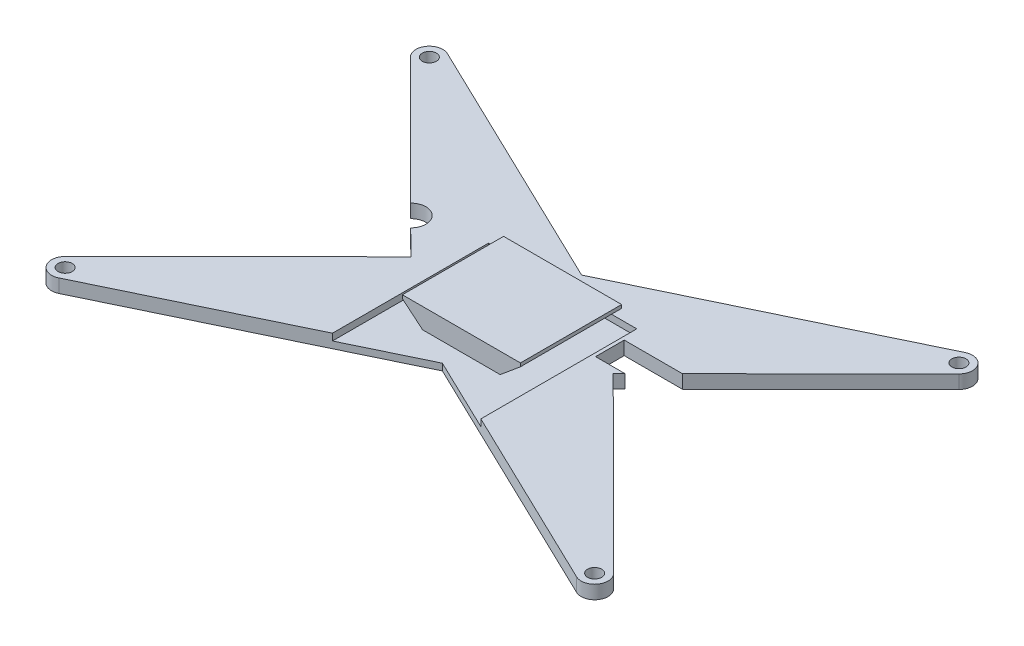
ISO-10303-21;
HEADER;
FILE_DESCRIPTION(('STEP AP214'),'2;1');
FILE_NAME('part.step','',(''),(''),'','','');
FILE_SCHEMA(('AUTOMOTIVE_DESIGN { 1 0 10303 214 1 1 1 1 }'));
ENDSEC;
DATA;
#1=APPLICATION_CONTEXT('core data for automotive mechanical design processes');
#2=APPLICATION_PROTOCOL_DEFINITION('international standard','automotive_design',2000,#1);
#3=PRODUCT_CONTEXT('',#1,'mechanical');
#4=PRODUCT('Part','Part','',(#3));
#5=PRODUCT_RELATED_PRODUCT_CATEGORY('part','',(#4));
#6=PRODUCT_DEFINITION_FORMATION('','',#4);
#7=PRODUCT_DEFINITION_CONTEXT('part definition',#1,'design');
#8=PRODUCT_DEFINITION('design','',#6,#7);
#9=PRODUCT_DEFINITION_SHAPE('','',#8);
#10=(LENGTH_UNIT() NAMED_UNIT(*) SI_UNIT(.MILLI.,.METRE.));
#11=(NAMED_UNIT(*) PLANE_ANGLE_UNIT() SI_UNIT($,.RADIAN.));
#12=(NAMED_UNIT(*) SI_UNIT($,.STERADIAN.) SOLID_ANGLE_UNIT());
#13=UNCERTAINTY_MEASURE_WITH_UNIT(LENGTH_MEASURE(1.E-05),#10,'distance_accuracy_value','');
#14=(GEOMETRIC_REPRESENTATION_CONTEXT(3) GLOBAL_UNCERTAINTY_ASSIGNED_CONTEXT((#13)) GLOBAL_UNIT_ASSIGNED_CONTEXT((#10,
#11,#12)) REPRESENTATION_CONTEXT('',''));
#15=CARTESIAN_POINT('',(0.,0.,0.));
#16=DIRECTION('',(0.,0.,1.));
#17=DIRECTION('',(1.,0.,0.));
#18=AXIS2_PLACEMENT_3D('',#15,#16,#17);
#19=CARTESIAN_POINT('',(14.9540896079356,-2.,14.9999297410321));
#20=DIRECTION('',(0.706023833590518,0.,0.708188072761854));
#21=DIRECTION('',(0.708188072761854,0.,-0.706023833590518));
#22=AXIS2_PLACEMENT_3D('',#19,#20,#21);
#23=PLANE('',#22);
#24=DIRECTION('',(0.,-1.,0.));
#25=VECTOR('',#24,1.);
#26=CARTESIAN_POINT('',(31.7565707063281,-2.,-1.75120258551938));
#27=LINE('',#26,#25);
#28=CARTESIAN_POINT('',(31.7565707063281,2.,-1.75120258551938));
#29=VERTEX_POINT('',#28);
#30=CARTESIAN_POINT('',(31.7565707063281,-2.,-1.75120258551938));
#31=VERTEX_POINT('',#30);
#32=EDGE_CURVE('E318',#29,#31,#27,.T.);
#33=ORIENTED_EDGE('',*,*,#32,.F.);
#34=DIRECTION('',(0.708188072761854,0.,-0.706023833590518));
#35=VECTOR('',#34,1.);
#36=CARTESIAN_POINT('',(14.9540896079356,2.,14.9999297410321));
#37=LINE('',#36,#35);
#38=CARTESIAN_POINT('',(30.,2.,0.));
#39=VERTEX_POINT('',#38);
#40=EDGE_CURVE('E339',#39,#29,#37,.T.);
#41=ORIENTED_EDGE('',*,*,#40,.F.);
#42=DIRECTION('',(0.,1.,0.));
#43=VECTOR('',#42,1.);
#44=CARTESIAN_POINT('',(30.,-2.,0.));
#45=LINE('',#44,#43);
#46=CARTESIAN_POINT('',(30.,-2.,0.));
#47=VERTEX_POINT('',#46);
#48=EDGE_CURVE('E497',#47,#39,#45,.T.);
#49=ORIENTED_EDGE('',*,*,#48,.F.);
#50=DIRECTION('',(0.708188072761854,0.,-0.706023833590518));
#51=VECTOR('',#50,1.);
#52=CARTESIAN_POINT('',(14.9540896079356,-2.,14.9999297410321));
#53=LINE('',#52,#51);
#54=EDGE_CURVE('E477',#47,#31,#53,.T.);
#55=ORIENTED_EDGE('',*,*,#54,.T.);
#56=EDGE_LOOP('',(#33,#41,#49,#55));
#57=FACE_BOUND('',#56,.T.);
#58=ADVANCED_FACE('F97',(#57),#23,.T.);
#59=CARTESIAN_POINT('',(-14.9540896079355,-2.,14.9999297410321));
#60=DIRECTION('',(0.706023833590518,0.,-0.708188072761854));
#61=DIRECTION('',(-0.708188072761854,0.,-0.706023833590518));
#62=AXIS2_PLACEMENT_3D('',#59,#60,#61);
#63=PLANE('',#62);
#64=DIRECTION('',(0.708188072761854,0.,0.706023833590518));
#65=VECTOR('',#64,1.);
#66=CARTESIAN_POINT('',(-14.9540896079355,2.,14.9999297410321));
#67=LINE('',#66,#65);
#68=CARTESIAN_POINT('',(-37.4359747639995,2.,-7.41325025270046));
#69=VERTEX_POINT('',#68);
#70=CARTESIAN_POINT('',(-30.,2.,0.));
#71=VERTEX_POINT('',#70);
#72=EDGE_CURVE('E354',#69,#71,#67,.T.);
#73=ORIENTED_EDGE('',*,*,#72,.F.);
#74=DIRECTION('',(0.,-1.,0.));
#75=VECTOR('',#74,1.);
#76=CARTESIAN_POINT('',(-37.4359747639995,31.,-7.41325025270046));
#77=LINE('',#76,#75);
#78=CARTESIAN_POINT('',(-37.4359747639995,-2.,-7.41325025270046));
#79=VERTEX_POINT('',#78);
#80=EDGE_CURVE('E113',#69,#79,#77,.T.);
#81=ORIENTED_EDGE('',*,*,#80,.T.);
#82=DIRECTION('',(-0.708188072761854,0.,-0.706023833590518));
#83=VECTOR('',#82,1.);
#84=CARTESIAN_POINT('',(-14.9540896079355,-2.,14.9999297410321));
#85=LINE('',#84,#83);
#86=CARTESIAN_POINT('',(-30.,-2.,0.));
#87=VERTEX_POINT('',#86);
#88=EDGE_CURVE('E459',#87,#79,#85,.T.);
#89=ORIENTED_EDGE('',*,*,#88,.F.);
#90=DIRECTION('',(0.,1.,0.));
#91=VECTOR('',#90,1.);
#92=CARTESIAN_POINT('',(-30.,-2.,0.));
#93=LINE('',#92,#91);
#94=EDGE_CURVE('E509',#87,#71,#93,.T.);
#95=ORIENTED_EDGE('',*,*,#94,.T.);
#96=EDGE_LOOP('',(#73,#81,#89,#95));
#97=FACE_BOUND('',#96,.T.);
#98=ADVANCED_FACE('F590',(#97),#63,.F.);
#99=CARTESIAN_POINT('',(0.,0.,0.));
#100=DIRECTION('',(0.,1.,0.));
#101=DIRECTION('',(0.,0.,1.));
#102=AXIS2_PLACEMENT_3D('',#99,#100,#101);
#103=PLANE('',#102);
#104=DIRECTION('',(0.,0.,-1.));
#105=VECTOR('',#104,1.);
#106=CARTESIAN_POINT('',(22.,0.,0.));
#107=LINE('',#106,#105);
#108=CARTESIAN_POINT('',(22.,0.,31.2313306001584));
#109=VERTEX_POINT('',#108);
#110=CARTESIAN_POINT('',(22.,0.,-15.));
#111=VERTEX_POINT('',#110);
#112=EDGE_CURVE('E382',#109,#111,#107,.T.);
#113=ORIENTED_EDGE('',*,*,#112,.T.);
#114=DIRECTION('',(1.,0.,0.));
#115=VECTOR('',#114,1.);
#116=CARTESIAN_POINT('',(-22.,0.,-15.));
#117=LINE('',#116,#115);
#118=CARTESIAN_POINT('',(11.5,0.,-15.));
#119=VERTEX_POINT('',#118);
#120=EDGE_CURVE('E324',#119,#111,#117,.T.);
#121=ORIENTED_EDGE('',*,*,#120,.F.);
#122=DIRECTION('',(0.,0.,-1.));
#123=VECTOR('',#122,1.);
#124=CARTESIAN_POINT('',(11.5,0.,-15.));
#125=LINE('',#124,#123);
#126=CARTESIAN_POINT('',(11.5,0.,15.));
#127=VERTEX_POINT('',#126);
#128=EDGE_CURVE('E443',#127,#119,#125,.T.);
#129=ORIENTED_EDGE('',*,*,#128,.F.);
#130=DIRECTION('',(1.,0.,0.));
#131=VECTOR('',#130,1.);
#132=CARTESIAN_POINT('',(-11.5,0.,15.));
#133=LINE('',#132,#131);
#134=CARTESIAN_POINT('',(-11.5,0.,15.));
#135=VERTEX_POINT('',#134);
#136=EDGE_CURVE('E448',#135,#127,#133,.T.);
#137=ORIENTED_EDGE('',*,*,#136,.F.);
#138=DIRECTION('',(0.,0.,1.));
#139=VECTOR('',#138,1.);
#140=CARTESIAN_POINT('',(-11.5,0.,-15.));
#141=LINE('',#140,#139);
#142=CARTESIAN_POINT('',(-11.5,0.,-15.));
#143=VERTEX_POINT('',#142);
#144=EDGE_CURVE('E446',#143,#135,#141,.T.);
#145=ORIENTED_EDGE('',*,*,#144,.F.);
#146=CARTESIAN_POINT('',(-22.,0.,-15.));
#147=VERTEX_POINT('',#146);
#148=EDGE_CURVE('E401',#147,#143,#117,.T.);
#149=ORIENTED_EDGE('',*,*,#148,.F.);
#150=DIRECTION('',(0.,0.,1.));
#151=VECTOR('',#150,1.);
#152=CARTESIAN_POINT('',(-22.,0.,0.));
#153=LINE('',#152,#151);
#154=CARTESIAN_POINT('',(-22.,0.,31.2313306001584));
#155=VERTEX_POINT('',#154);
#156=EDGE_CURVE('E329',#147,#155,#153,.T.);
#157=ORIENTED_EDGE('',*,*,#156,.T.);
#158=DIRECTION('',(-0.90097292924137,0.,0.433875305559357));
#159=VECTOR('',#158,1.);
#160=CARTESIAN_POINT('',(8.06718530012738,0.,16.7520840145956));
#161=LINE('',#160,#159);
#162=CARTESIAN_POINT('',(0.,0.,20.6369426751592));
#163=VERTEX_POINT('',#162);
#164=EDGE_CURVE('E451',#163,#155,#161,.T.);
#165=ORIENTED_EDGE('',*,*,#164,.F.);
#166=DIRECTION('',(0.90097292924137,0.,0.433875305559357));
#167=VECTOR('',#166,1.);
#168=CARTESIAN_POINT('',(-8.06718530012738,0.,16.7520840145956));
#169=LINE('',#168,#167);
#170=EDGE_CURVE('E456',#163,#109,#169,.T.);
#171=ORIENTED_EDGE('',*,*,#170,.T.);
#172=EDGE_LOOP('',(#113,#121,#129,#137,#145,#149,#157,#165,#171));
#173=FACE_BOUND('',#172,.T.);
#174=ADVANCED_FACE('F597',(#173),#103,.T.);
#175=CARTESIAN_POINT('',(8.06718530012738,-2.,-16.7520840145956));
#176=DIRECTION('',(0.433875305559357,0.,-0.90097292924137));
#177=DIRECTION('',(-0.90097292924137,0.,-0.433875305559357));
#178=AXIS2_PLACEMENT_3D('',#175,#176,#177);
#179=PLANE('',#178);
#180=DIRECTION('',(0.,1.,0.));
#181=VECTOR('',#180,1.);
#182=CARTESIAN_POINT('',(-76.7644987777626,-2.,-57.6038917169655));
#183=LINE('',#182,#181);
#184=CARTESIAN_POINT('',(-76.7644987777626,-2.,-57.6038917169655));
#185=VERTEX_POINT('',#184);
#186=CARTESIAN_POINT('',(-76.7644987777626,2.,-57.6038917169655));
#187=VERTEX_POINT('',#186);
#188=EDGE_CURVE('E485',#185,#187,#183,.T.);
#189=ORIENTED_EDGE('',*,*,#188,.T.);
#190=DIRECTION('',(-0.90097292924137,0.,-0.433875305559357));
#191=VECTOR('',#190,1.);
#192=CARTESIAN_POINT('',(8.06718530012739,2.,-16.7520840145956));
#193=LINE('',#192,#191);
#194=CARTESIAN_POINT('',(0.,2.,-20.6369426751592));
#195=VERTEX_POINT('',#194);
#196=EDGE_CURVE('E348',#195,#187,#193,.T.);
#197=ORIENTED_EDGE('',*,*,#196,.F.);
#198=DIRECTION('',(0.,1.,0.));
#199=VECTOR('',#198,1.);
#200=CARTESIAN_POINT('',(0.,-2.,-20.6369426751592));
#201=LINE('',#200,#199);
#202=CARTESIAN_POINT('',(0.,-2.,-20.6369426751592));
#203=VERTEX_POINT('',#202);
#204=EDGE_CURVE('E490',#203,#195,#201,.T.);
#205=ORIENTED_EDGE('',*,*,#204,.F.);
#206=DIRECTION('',(-0.90097292924137,0.,-0.433875305559357));
#207=VECTOR('',#206,1.);
#208=CARTESIAN_POINT('',(8.06718530012738,-2.,-16.7520840145956));
#209=LINE('',#208,#207);
#210=EDGE_CURVE('E452',#203,#185,#209,.T.);
#211=ORIENTED_EDGE('',*,*,#210,.T.);
#212=EDGE_LOOP('',(#189,#197,#205,#211));
#213=FACE_BOUND('',#212,.T.);
#214=ADVANCED_FACE('F661',(#213),#179,.T.);
#215=CARTESIAN_POINT('',(-8.06718530012738,-2.,-16.7520840145956));
#216=DIRECTION('',(0.433875305559357,0.,0.90097292924137));
#217=DIRECTION('',(0.90097292924137,0.,-0.433875305559357));
#218=AXIS2_PLACEMENT_3D('',#215,#216,#217);
#219=PLANE('',#218);
#220=ORIENTED_EDGE('',*,*,#204,.T.);
#221=DIRECTION('',(-0.90097292924137,0.,0.433875305559357));
#222=VECTOR('',#221,1.);
#223=CARTESIAN_POINT('',(-8.06718530012739,2.,-16.7520840145956));
#224=LINE('',#223,#222);
#225=CARTESIAN_POINT('',(76.7644987777626,2.,-57.6038917169655));
#226=VERTEX_POINT('',#225);
#227=EDGE_CURVE('E345',#226,#195,#224,.T.);
#228=ORIENTED_EDGE('',*,*,#227,.F.);
#229=DIRECTION('',(0.,1.,0.));
#230=VECTOR('',#229,1.);
#231=CARTESIAN_POINT('',(76.7644987777626,-2.,-57.6038917169655));
#232=LINE('',#231,#230);
#233=CARTESIAN_POINT('',(76.7644987777626,-2.,-57.6038917169655));
#234=VERTEX_POINT('',#233);
#235=EDGE_CURVE('E492',#234,#226,#232,.T.);
#236=ORIENTED_EDGE('',*,*,#235,.F.);
#237=DIRECTION('',(0.90097292924137,0.,-0.433875305559357));
#238=VECTOR('',#237,1.);
#239=CARTESIAN_POINT('',(-8.06718530012738,-2.,-16.7520840145956));
#240=LINE('',#239,#238);
#241=EDGE_CURVE('E483',#203,#234,#240,.T.);
#242=ORIENTED_EDGE('',*,*,#241,.F.);
#243=EDGE_LOOP('',(#220,#228,#236,#242));
#244=FACE_BOUND('',#243,.T.);
#245=ADVANCED_FACE('F613',(#244),#219,.F.);
#246=CARTESIAN_POINT('',(78.5,-2.,-54.));
#247=DIRECTION('',(0.,1.,0.));
#248=DIRECTION('',(0.,0.,1.));
#249=AXIS2_PLACEMENT_3D('',#246,#247,#248);
#250=CYLINDRICAL_SURFACE('',#249,4.00000000000001);
#251=ORIENTED_EDGE('',*,*,#235,.T.);
#252=CARTESIAN_POINT('',(78.5,2.,-54.));
#253=DIRECTION('',(0.,1.,0.));
#254=DIRECTION('',(0.,0.,1.));
#255=AXIS2_PLACEMENT_3D('',#252,#253,#254);
#256=CIRCLE('',#255,4.00000000000001);
#257=CARTESIAN_POINT('',(81.3240953343621,2.,-51.1672477089526));
#258=VERTEX_POINT('',#257);
#259=EDGE_CURVE('E342',#258,#226,#256,.T.);
#260=ORIENTED_EDGE('',*,*,#259,.F.);
#261=DIRECTION('',(0.,1.,0.));
#262=VECTOR('',#261,1.);
#263=CARTESIAN_POINT('',(81.3240953343621,-2.,-51.1672477089526));
#264=LINE('',#263,#262);
#265=CARTESIAN_POINT('',(81.3240953343621,-2.,-51.1672477089526));
#266=VERTEX_POINT('',#265);
#267=EDGE_CURVE('E494',#266,#258,#264,.T.);
#268=ORIENTED_EDGE('',*,*,#267,.F.);
#269=CARTESIAN_POINT('',(78.5,-2.,-54.));
#270=DIRECTION('',(0.,1.,0.));
#271=DIRECTION('',(0.,0.,1.));
#272=AXIS2_PLACEMENT_3D('',#269,#270,#271);
#273=CIRCLE('',#272,4.00000000000001);
#274=EDGE_CURVE('E480',#266,#234,#273,.T.);
#275=ORIENTED_EDGE('',*,*,#274,.T.);
#276=EDGE_LOOP('',(#251,#260,#268,#275));
#277=FACE_BOUND('',#276,.T.);
#278=ADVANCED_FACE('F605',(#277),#250,.T.);
#279=DIRECTION('',(0.,1.,0.));
#280=VECTOR('',#279,1.);
#281=CARTESIAN_POINT('',(40.2826265306234,-2.,-10.2512025855194));
#282=LINE('',#281,#280);
#283=CARTESIAN_POINT('',(40.2826265306234,-2.,-10.2512025855194));
#284=VERTEX_POINT('',#283);
#285=CARTESIAN_POINT('',(40.2826265306234,2.,-10.2512025855194));
#286=VERTEX_POINT('',#285);
#287=EDGE_CURVE('E121',#284,#286,#282,.T.);
#288=ORIENTED_EDGE('',*,*,#287,.F.);
#289=EDGE_CURVE('E310',#284,#266,#53,.T.);
#290=ORIENTED_EDGE('',*,*,#289,.T.);
#291=ORIENTED_EDGE('',*,*,#267,.T.);
#292=EDGE_CURVE('E338',#286,#258,#37,.T.);
#293=ORIENTED_EDGE('',*,*,#292,.F.);
#294=EDGE_LOOP('',(#288,#290,#291,#293));
#295=FACE_BOUND('',#294,.T.);
#296=ADVANCED_FACE('F593',(#295),#23,.T.);
#297=CARTESIAN_POINT('',(14.9540896079356,-2.,-14.9999297410322));
#298=DIRECTION('',(-0.706023833590518,0.,0.708188072761854));
#299=DIRECTION('',(0.708188072761854,0.,0.706023833590518));
#300=AXIS2_PLACEMENT_3D('',#297,#298,#299);
#301=PLANE('',#300);
#302=ORIENTED_EDGE('',*,*,#48,.T.);
#303=DIRECTION('',(-0.708188072761854,0.,-0.706023833590518));
#304=VECTOR('',#303,1.);
#305=CARTESIAN_POINT('',(14.9540896079356,2.,-14.9999297410322));
#306=LINE('',#305,#304);
#307=CARTESIAN_POINT('',(81.3240953343621,2.,51.1672477089526));
#308=VERTEX_POINT('',#307);
#309=EDGE_CURVE('E335',#308,#39,#306,.T.);
#310=ORIENTED_EDGE('',*,*,#309,.F.);
#311=DIRECTION('',(0.,1.,0.));
#312=VECTOR('',#311,1.);
#313=CARTESIAN_POINT('',(81.3240953343621,-2.,51.1672477089526));
#314=LINE('',#313,#312);
#315=CARTESIAN_POINT('',(81.3240953343621,-2.,51.1672477089526));
#316=VERTEX_POINT('',#315);
#317=EDGE_CURVE('E499',#316,#308,#314,.T.);
#318=ORIENTED_EDGE('',*,*,#317,.F.);
#319=DIRECTION('',(0.708188072761854,0.,0.706023833590518));
#320=VECTOR('',#319,1.);
#321=CARTESIAN_POINT('',(14.9540896079356,-2.,-14.9999297410322));
#322=LINE('',#321,#320);
#323=EDGE_CURVE('E474',#47,#316,#322,.T.);
#324=ORIENTED_EDGE('',*,*,#323,.F.);
#325=EDGE_LOOP('',(#302,#310,#318,#324));
#326=FACE_BOUND('',#325,.T.);
#327=ADVANCED_FACE('F604',(#326),#301,.F.);
#328=CARTESIAN_POINT('',(78.5,-2.,54.));
#329=DIRECTION('',(0.,1.,0.));
#330=DIRECTION('',(0.,0.,1.));
#331=AXIS2_PLACEMENT_3D('',#328,#329,#330);
#332=CYLINDRICAL_SURFACE('',#331,4.00000000000001);
#333=ORIENTED_EDGE('',*,*,#317,.T.);
#334=CARTESIAN_POINT('',(78.5,2.,54.));
#335=DIRECTION('',(0.,1.,0.));
#336=DIRECTION('',(0.,0.,1.));
#337=AXIS2_PLACEMENT_3D('',#334,#335,#336);
#338=CIRCLE('',#337,4.00000000000001);
#339=CARTESIAN_POINT('',(76.7644987777626,2.,57.6038917169655));
#340=VERTEX_POINT('',#339);
#341=EDGE_CURVE('E332',#340,#308,#338,.T.);
#342=ORIENTED_EDGE('',*,*,#341,.F.);
#343=DIRECTION('',(0.,1.,0.));
#344=VECTOR('',#343,1.);
#345=CARTESIAN_POINT('',(76.7644987777626,-2.,57.6038917169655));
#346=LINE('',#345,#344);
#347=CARTESIAN_POINT('',(76.7644987777626,-2.,57.6038917169655));
#348=VERTEX_POINT('',#347);
#349=EDGE_CURVE('E501',#348,#340,#346,.T.);
#350=ORIENTED_EDGE('',*,*,#349,.F.);
#351=CARTESIAN_POINT('',(78.5,-2.,54.));
#352=DIRECTION('',(0.,1.,0.));
#353=DIRECTION('',(0.,0.,1.));
#354=AXIS2_PLACEMENT_3D('',#351,#352,#353);
#355=CIRCLE('',#354,4.00000000000001);
#356=EDGE_CURVE('E472',#316,#348,#355,.F.);
#357=ORIENTED_EDGE('',*,*,#356,.F.);
#358=EDGE_LOOP('',(#333,#342,#350,#357));
#359=FACE_BOUND('',#358,.T.);
#360=ADVANCED_FACE('F611',(#359),#332,.T.);
#361=CARTESIAN_POINT('',(-8.06718530012738,-2.,16.7520840145956));
#362=DIRECTION('',(-0.433875305559357,0.,0.90097292924137));
#363=DIRECTION('',(0.90097292924137,0.,0.433875305559357));
#364=AXIS2_PLACEMENT_3D('',#361,#362,#363);
#365=PLANE('',#364);
#366=ORIENTED_EDGE('',*,*,#170,.F.);
#367=DIRECTION('',(0.,1.,0.));
#368=VECTOR('',#367,1.);
#369=CARTESIAN_POINT('',(0.,-2.,20.6369426751592));
#370=LINE('',#369,#368);
#371=CARTESIAN_POINT('',(0.,-2.,20.6369426751592));
#372=VERTEX_POINT('',#371);
#373=EDGE_CURVE('E503',#372,#163,#370,.T.);
#374=ORIENTED_EDGE('',*,*,#373,.F.);
#375=DIRECTION('',(0.90097292924137,0.,0.433875305559357));
#376=VECTOR('',#375,1.);
#377=CARTESIAN_POINT('',(-8.06718530012738,-2.,16.7520840145956));
#378=LINE('',#377,#376);
#379=EDGE_CURVE('E469',#372,#348,#378,.T.);
#380=ORIENTED_EDGE('',*,*,#379,.T.);
#381=ORIENTED_EDGE('',*,*,#349,.T.);
#382=DIRECTION('',(0.90097292924137,0.,0.433875305559357));
#383=VECTOR('',#382,1.);
#384=CARTESIAN_POINT('',(-8.06718530012739,2.,16.7520840145956));
#385=LINE('',#384,#383);
#386=CARTESIAN_POINT('',(22.,2.,31.2313306001584));
#387=VERTEX_POINT('',#386);
#388=EDGE_CURVE('E328',#387,#340,#385,.T.);
#389=ORIENTED_EDGE('',*,*,#388,.F.);
#390=DIRECTION('',(0.,-1.,0.));
#391=VECTOR('',#390,1.);
#392=CARTESIAN_POINT('',(22.,2.,31.2313306001584));
#393=LINE('',#392,#391);
#394=EDGE_CURVE('E389',#387,#109,#393,.T.);
#395=ORIENTED_EDGE('',*,*,#394,.T.);
#396=EDGE_LOOP('',(#366,#374,#380,#381,#389,#395));
#397=FACE_BOUND('',#396,.T.);
#398=ADVANCED_FACE('F634',(#397),#365,.T.);
#399=CARTESIAN_POINT('',(8.06718530012738,-2.,16.7520840145956));
#400=DIRECTION('',(-0.433875305559357,0.,-0.90097292924137));
#401=DIRECTION('',(-0.90097292924137,0.,0.433875305559357));
#402=AXIS2_PLACEMENT_3D('',#399,#400,#401);
#403=PLANE('',#402);
#404=ORIENTED_EDGE('',*,*,#164,.T.);
#405=DIRECTION('',(0.,-1.,0.));
#406=VECTOR('',#405,1.);
#407=CARTESIAN_POINT('',(-22.,2.,31.2313306001584));
#408=LINE('',#407,#406);
#409=CARTESIAN_POINT('',(-22.,2.,31.2313306001584));
#410=VERTEX_POINT('',#409);
#411=EDGE_CURVE('E381',#410,#155,#408,.T.);
#412=ORIENTED_EDGE('',*,*,#411,.F.);
#413=DIRECTION('',(0.90097292924137,0.,-0.433875305559357));
#414=VECTOR('',#413,1.);
#415=CARTESIAN_POINT('',(8.06718530012739,2.,16.7520840145956));
#416=LINE('',#415,#414);
#417=CARTESIAN_POINT('',(-76.7644987777626,2.,57.6038917169655));
#418=VERTEX_POINT('',#417);
#419=EDGE_CURVE('E364',#418,#410,#416,.T.);
#420=ORIENTED_EDGE('',*,*,#419,.F.);
#421=DIRECTION('',(0.,1.,0.));
#422=VECTOR('',#421,1.);
#423=CARTESIAN_POINT('',(-76.7644987777626,-2.,57.6038917169655));
#424=LINE('',#423,#422);
#425=CARTESIAN_POINT('',(-76.7644987777626,-2.,57.6038917169655));
#426=VERTEX_POINT('',#425);
#427=EDGE_CURVE('E505',#426,#418,#424,.T.);
#428=ORIENTED_EDGE('',*,*,#427,.F.);
#429=DIRECTION('',(-0.90097292924137,0.,0.433875305559357));
#430=VECTOR('',#429,1.);
#431=CARTESIAN_POINT('',(8.06718530012738,-2.,16.7520840145956));
#432=LINE('',#431,#430);
#433=EDGE_CURVE('E467',#372,#426,#432,.T.);
#434=ORIENTED_EDGE('',*,*,#433,.F.);
#435=ORIENTED_EDGE('',*,*,#373,.T.);
#436=EDGE_LOOP('',(#404,#412,#420,#428,#434,#435));
#437=FACE_BOUND('',#436,.T.);
#438=ADVANCED_FACE('F639',(#437),#403,.F.);
#439=CARTESIAN_POINT('',(-78.5,-2.,54.));
#440=DIRECTION('',(0.,1.,0.));
#441=DIRECTION('',(0.,0.,1.));
#442=AXIS2_PLACEMENT_3D('',#439,#440,#441);
#443=CYLINDRICAL_SURFACE('',#442,4.00000000000001);
#444=ORIENTED_EDGE('',*,*,#427,.T.);
#445=CARTESIAN_POINT('',(-78.5,2.,54.));
#446=DIRECTION('',(0.,1.,0.));
#447=DIRECTION('',(0.,0.,1.));
#448=AXIS2_PLACEMENT_3D('',#445,#446,#447);
#449=CIRCLE('',#448,4.00000000000001);
#450=CARTESIAN_POINT('',(-81.3240953343621,2.,51.1672477089526));
#451=VERTEX_POINT('',#450);
#452=EDGE_CURVE('E361',#451,#418,#449,.T.);
#453=ORIENTED_EDGE('',*,*,#452,.F.);
#454=DIRECTION('',(0.,1.,0.));
#455=VECTOR('',#454,1.);
#456=CARTESIAN_POINT('',(-81.3240953343621,-2.,51.1672477089526));
#457=LINE('',#456,#455);
#458=CARTESIAN_POINT('',(-81.3240953343621,-2.,51.1672477089526));
#459=VERTEX_POINT('',#458);
#460=EDGE_CURVE('E507',#459,#451,#457,.T.);
#461=ORIENTED_EDGE('',*,*,#460,.F.);
#462=CARTESIAN_POINT('',(-78.5,-2.,54.));
#463=DIRECTION('',(0.,1.,0.));
#464=DIRECTION('',(0.,0.,1.));
#465=AXIS2_PLACEMENT_3D('',#462,#463,#464);
#466=CIRCLE('',#465,4.00000000000001);
#467=EDGE_CURVE('E464',#459,#426,#466,.T.);
#468=ORIENTED_EDGE('',*,*,#467,.T.);
#469=EDGE_LOOP('',(#444,#453,#461,#468));
#470=FACE_BOUND('',#469,.T.);
#471=ADVANCED_FACE('F739',(#470),#443,.T.);
#472=CARTESIAN_POINT('',(-14.9540896079356,-2.,-14.9999297410322));
#473=DIRECTION('',(-0.706023833590518,0.,-0.708188072761854));
#474=DIRECTION('',(-0.708188072761854,0.,0.706023833590518));
#475=AXIS2_PLACEMENT_3D('',#472,#473,#474);
#476=PLANE('',#475);
#477=ORIENTED_EDGE('',*,*,#460,.T.);
#478=DIRECTION('',(-0.708188072761854,0.,0.706023833590518));
#479=VECTOR('',#478,1.);
#480=CARTESIAN_POINT('',(-14.9540896079356,2.,-14.9999297410322));
#481=LINE('',#480,#479);
#482=EDGE_CURVE('E358',#71,#451,#481,.T.);
#483=ORIENTED_EDGE('',*,*,#482,.F.);
#484=ORIENTED_EDGE('',*,*,#94,.F.);
#485=DIRECTION('',(-0.708188072761854,0.,0.706023833590518));
#486=VECTOR('',#485,1.);
#487=CARTESIAN_POINT('',(-14.9540896079356,-2.,-14.9999297410322));
#488=LINE('',#487,#486);
#489=EDGE_CURVE('E461',#87,#459,#488,.T.);
#490=ORIENTED_EDGE('',*,*,#489,.T.);
#491=EDGE_LOOP('',(#477,#483,#484,#490));
#492=FACE_BOUND('',#491,.T.);
#493=ADVANCED_FACE('F645',(#492),#476,.T.);
#494=CARTESIAN_POINT('',(-43.8096674188562,-2.,-13.7674647550151));
#495=VERTEX_POINT('',#494);
#496=CARTESIAN_POINT('',(-81.3240953343621,-2.,-51.1672477089526));
#497=VERTEX_POINT('',#496);
#498=EDGE_CURVE('E458',#495,#497,#85,.T.);
#499=ORIENTED_EDGE('',*,*,#498,.F.);
#500=DIRECTION('',(0.,-1.,0.));
#501=VECTOR('',#500,1.);
#502=CARTESIAN_POINT('',(-43.8096674188562,31.,-13.7674647550151));
#503=LINE('',#502,#501);
#504=CARTESIAN_POINT('',(-43.8096674188562,2.,-13.7674647550151));
#505=VERTEX_POINT('',#504);
#506=EDGE_CURVE('E320',#495,#505,#503,.F.);
#507=ORIENTED_EDGE('',*,*,#506,.T.);
#508=CARTESIAN_POINT('',(-81.3240953343621,2.,-51.1672477089526));
#509=VERTEX_POINT('',#508);
#510=EDGE_CURVE('E355',#509,#505,#67,.T.);
#511=ORIENTED_EDGE('',*,*,#510,.F.);
#512=DIRECTION('',(0.,1.,0.));
#513=VECTOR('',#512,1.);
#514=CARTESIAN_POINT('',(-81.3240953343621,-2.,-51.1672477089526));
#515=LINE('',#514,#513);
#516=EDGE_CURVE('E512',#497,#509,#515,.T.);
#517=ORIENTED_EDGE('',*,*,#516,.F.);
#518=EDGE_LOOP('',(#499,#507,#511,#517));
#519=FACE_BOUND('',#518,.T.);
#520=ADVANCED_FACE('F566',(#519),#63,.F.);
#521=CARTESIAN_POINT('',(-78.5,-2.,54.));
#522=DIRECTION('',(0.,1.,0.));
#523=DIRECTION('',(0.,0.,1.));
#524=AXIS2_PLACEMENT_3D('',#521,#522,#523);
#525=CYLINDRICAL_SURFACE('',#524,2.1);
#526=CARTESIAN_POINT('',(-78.5,-1.49999999999998,54.));
#527=DIRECTION('',(0.,1.,0.));
#528=DIRECTION('',(0.,0.,1.));
#529=AXIS2_PLACEMENT_3D('',#526,#527,#528);
#530=CIRCLE('',#529,2.1);
#531=CARTESIAN_POINT('',(-78.5,-1.49999999999998,56.1));
#532=VERTEX_POINT('',#531);
#533=EDGE_CURVE('E12',#532,#532,#530,.F.);
#534=ORIENTED_EDGE('',*,*,#533,.T.);
#535=EDGE_LOOP('',(#534));
#536=FACE_BOUND('',#535,.T.);
#537=CARTESIAN_POINT('',(-78.5,2.,54.));
#538=DIRECTION('',(0.,1.,0.));
#539=DIRECTION('',(0.,0.,1.));
#540=AXIS2_PLACEMENT_3D('',#537,#538,#539);
#541=CIRCLE('',#540,2.1);
#542=CARTESIAN_POINT('',(-78.5,2.,56.1));
#543=VERTEX_POINT('',#542);
#544=EDGE_CURVE('E378',#543,#543,#541,.F.);
#545=ORIENTED_EDGE('',*,*,#544,.F.);
#546=EDGE_LOOP('',(#545));
#547=FACE_BOUND('',#546,.T.);
#548=ADVANCED_FACE('F562',(#536,#547),#525,.F.);
#549=CARTESIAN_POINT('',(-78.5,-2.,-54.));
#550=DIRECTION('',(0.,1.,0.));
#551=DIRECTION('',(0.,0.,1.));
#552=AXIS2_PLACEMENT_3D('',#549,#550,#551);
#553=CYLINDRICAL_SURFACE('',#552,2.1);
#554=CARTESIAN_POINT('',(-78.5,-1.49999999999998,-54.));
#555=DIRECTION('',(0.,1.,0.));
#556=DIRECTION('',(0.,0.,1.));
#557=AXIS2_PLACEMENT_3D('',#554,#555,#556);
#558=CIRCLE('',#557,2.1);
#559=CARTESIAN_POINT('',(-78.5,-1.49999999999998,-51.9));
#560=VERTEX_POINT('',#559);
#561=EDGE_CURVE('E522',#560,#560,#558,.F.);
#562=ORIENTED_EDGE('',*,*,#561,.T.);
#563=EDGE_LOOP('',(#562));
#564=FACE_BOUND('',#563,.T.);
#565=CARTESIAN_POINT('',(-78.5,2.,-54.));
#566=DIRECTION('',(0.,1.,0.));
#567=DIRECTION('',(0.,0.,1.));
#568=AXIS2_PLACEMENT_3D('',#565,#566,#567);
#569=CIRCLE('',#568,2.1);
#570=CARTESIAN_POINT('',(-78.5,2.,-51.9));
#571=VERTEX_POINT('',#570);
#572=EDGE_CURVE('E372',#571,#571,#569,.F.);
#573=ORIENTED_EDGE('',*,*,#572,.F.);
#574=EDGE_LOOP('',(#573));
#575=FACE_BOUND('',#574,.T.);
#576=ADVANCED_FACE('F565',(#564,#575),#553,.F.);
#577=CARTESIAN_POINT('',(-78.5,-2.,-54.));
#578=DIRECTION('',(0.,1.,0.));
#579=DIRECTION('',(0.,0.,1.));
#580=AXIS2_PLACEMENT_3D('',#577,#578,#579);
#581=CYLINDRICAL_SURFACE('',#580,4.00000000000001);
#582=ORIENTED_EDGE('',*,*,#516,.T.);
#583=CARTESIAN_POINT('',(-78.5,2.,-54.));
#584=DIRECTION('',(0.,1.,0.));
#585=DIRECTION('',(0.,0.,1.));
#586=AXIS2_PLACEMENT_3D('',#583,#584,#585);
#587=CIRCLE('',#586,4.00000000000001);
#588=EDGE_CURVE('E351',#187,#509,#587,.T.);
#589=ORIENTED_EDGE('',*,*,#588,.F.);
#590=ORIENTED_EDGE('',*,*,#188,.F.);
#591=CARTESIAN_POINT('',(-78.5,-2.,-54.));
#592=DIRECTION('',(0.,1.,0.));
#593=DIRECTION('',(0.,0.,1.));
#594=AXIS2_PLACEMENT_3D('',#591,#592,#593);
#595=CIRCLE('',#594,4.00000000000001);
#596=EDGE_CURVE('E455',#497,#185,#595,.F.);
#597=ORIENTED_EDGE('',*,*,#596,.F.);
#598=EDGE_LOOP('',(#582,#589,#590,#597));
#599=FACE_BOUND('',#598,.T.);
#600=ADVANCED_FACE('F657',(#599),#581,.T.);
#601=CARTESIAN_POINT('',(78.5,-2.,-54.));
#602=DIRECTION('',(0.,1.,0.));
#603=DIRECTION('',(0.,0.,1.));
#604=AXIS2_PLACEMENT_3D('',#601,#602,#603);
#605=CYLINDRICAL_SURFACE('',#604,2.1);
#606=CARTESIAN_POINT('',(78.5,-1.50000000000001,-54.));
#607=DIRECTION('',(0.,1.,0.));
#608=DIRECTION('',(0.,0.,1.));
#609=AXIS2_PLACEMENT_3D('',#606,#607,#608);
#610=CIRCLE('',#609,2.1);
#611=CARTESIAN_POINT('',(78.5,-1.50000000000001,-51.9));
#612=VERTEX_POINT('',#611);
#613=EDGE_CURVE('E537',#612,#612,#610,.F.);
#614=ORIENTED_EDGE('',*,*,#613,.T.);
#615=EDGE_LOOP('',(#614));
#616=FACE_BOUND('',#615,.T.);
#617=CARTESIAN_POINT('',(78.5,2.,-54.));
#618=DIRECTION('',(0.,1.,0.));
#619=DIRECTION('',(0.,0.,1.));
#620=AXIS2_PLACEMENT_3D('',#617,#618,#619);
#621=CIRCLE('',#620,2.1);
#622=CARTESIAN_POINT('',(78.5,2.,-51.9));
#623=VERTEX_POINT('',#622);
#624=EDGE_CURVE('E369',#623,#623,#621,.F.);
#625=ORIENTED_EDGE('',*,*,#624,.F.);
#626=EDGE_LOOP('',(#625));
#627=FACE_BOUND('',#626,.T.);
#628=ADVANCED_FACE('F678',(#616,#627),#605,.F.);
#629=CARTESIAN_POINT('',(78.5,-2.,54.));
#630=DIRECTION('',(0.,1.,0.));
#631=DIRECTION('',(0.,0.,1.));
#632=AXIS2_PLACEMENT_3D('',#629,#630,#631);
#633=CYLINDRICAL_SURFACE('',#632,2.1);
#634=CARTESIAN_POINT('',(78.5,-1.50000000000001,54.));
#635=DIRECTION('',(0.,1.,0.));
#636=DIRECTION('',(0.,0.,1.));
#637=AXIS2_PLACEMENT_3D('',#634,#635,#636);
#638=CIRCLE('',#637,2.1);
#639=CARTESIAN_POINT('',(78.5,-1.50000000000001,56.1));
#640=VERTEX_POINT('',#639);
#641=EDGE_CURVE('E106',#640,#640,#638,.F.);
#642=ORIENTED_EDGE('',*,*,#641,.T.);
#643=EDGE_LOOP('',(#642));
#644=FACE_BOUND('',#643,.T.);
#645=CARTESIAN_POINT('',(78.5,2.,54.));
#646=DIRECTION('',(0.,1.,0.));
#647=DIRECTION('',(0.,0.,1.));
#648=AXIS2_PLACEMENT_3D('',#645,#646,#647);
#649=CIRCLE('',#648,2.1);
#650=CARTESIAN_POINT('',(78.5,2.,56.1));
#651=VERTEX_POINT('',#650);
#652=EDGE_CURVE('E375',#651,#651,#649,.F.);
#653=ORIENTED_EDGE('',*,*,#652,.F.);
#654=EDGE_LOOP('',(#653));
#655=FACE_BOUND('',#654,.T.);
#656=ADVANCED_FACE('F542',(#644,#655),#633,.F.);
#657=CARTESIAN_POINT('',(0.,-2.,0.));
#658=DIRECTION('',(0.,1.,0.));
#659=DIRECTION('',(0.,0.,1.));
#660=AXIS2_PLACEMENT_3D('',#657,#658,#659);
#661=PLANE('',#660);
#662=CARTESIAN_POINT('',(-78.5,-2.,-54.));
#663=DIRECTION('',(0.,1.,0.));
#664=DIRECTION('',(0.,0.,1.));
#665=AXIS2_PLACEMENT_3D('',#662,#663,#664);
#666=CIRCLE('',#665,2.60000000000002);
#667=CARTESIAN_POINT('',(-78.5,-2.,-51.4));
#668=VERTEX_POINT('',#667);
#669=EDGE_CURVE('E534',#668,#668,#666,.T.);
#670=ORIENTED_EDGE('',*,*,#669,.T.);
#671=EDGE_LOOP('',(#670));
#672=FACE_BOUND('',#671,.T.);
#673=CARTESIAN_POINT('',(78.5,-2.,-54.));
#674=DIRECTION('',(0.,1.,0.));
#675=DIRECTION('',(0.,0.,1.));
#676=AXIS2_PLACEMENT_3D('',#673,#674,#675);
#677=CIRCLE('',#676,2.59999999999999);
#678=CARTESIAN_POINT('',(78.5,-2.,-51.4));
#679=VERTEX_POINT('',#678);
#680=EDGE_CURVE('E531',#679,#679,#677,.T.);
#681=ORIENTED_EDGE('',*,*,#680,.T.);
#682=EDGE_LOOP('',(#681));
#683=FACE_BOUND('',#682,.T.);
#684=CARTESIAN_POINT('',(78.5,-2.,54.));
#685=DIRECTION('',(0.,1.,0.));
#686=DIRECTION('',(0.,0.,1.));
#687=AXIS2_PLACEMENT_3D('',#684,#685,#686);
#688=CIRCLE('',#687,2.59999999999999);
#689=CARTESIAN_POINT('',(78.5,-2.,56.6));
#690=VERTEX_POINT('',#689);
#691=EDGE_CURVE('E528',#690,#690,#688,.T.);
#692=ORIENTED_EDGE('',*,*,#691,.T.);
#693=EDGE_LOOP('',(#692));
#694=FACE_BOUND('',#693,.T.);
#695=CARTESIAN_POINT('',(-78.5,-2.,54.));
#696=DIRECTION('',(0.,1.,0.));
#697=DIRECTION('',(0.,0.,1.));
#698=AXIS2_PLACEMENT_3D('',#695,#696,#697);
#699=CIRCLE('',#698,2.60000000000002);
#700=CARTESIAN_POINT('',(-78.5,-2.,56.6));
#701=VERTEX_POINT('',#700);
#702=EDGE_CURVE('E525',#701,#701,#699,.T.);
#703=ORIENTED_EDGE('',*,*,#702,.T.);
#704=EDGE_LOOP('',(#703));
#705=FACE_BOUND('',#704,.T.);
#706=ORIENTED_EDGE('',*,*,#88,.T.);
#707=CARTESIAN_POINT('',(-40.6228210914278,-2.,-10.5903575038578));
#708=DIRECTION('',(0.,-1.,0.));
#709=DIRECTION('',(0.,0.,-1.));
#710=AXIS2_PLACEMENT_3D('',#707,#708,#709);
#711=CIRCLE('',#710,4.5);
#712=EDGE_CURVE('E315',#495,#79,#711,.T.);
#713=ORIENTED_EDGE('',*,*,#712,.F.);
#714=ORIENTED_EDGE('',*,*,#498,.T.);
#715=ORIENTED_EDGE('',*,*,#596,.T.);
#716=ORIENTED_EDGE('',*,*,#210,.F.);
#717=ORIENTED_EDGE('',*,*,#241,.T.);
#718=ORIENTED_EDGE('',*,*,#274,.F.);
#719=ORIENTED_EDGE('',*,*,#289,.F.);
#720=DIRECTION('',(1.,0.,0.));
#721=VECTOR('',#720,1.);
#722=CARTESIAN_POINT('',(49.0195986184758,-2.,-10.2512025855194));
#723=LINE('',#722,#721);
#724=CARTESIAN_POINT('',(23.0195986184758,-2.,-10.2512025855194));
#725=VERTEX_POINT('',#724);
#726=EDGE_CURVE('E291',#725,#284,#723,.T.);
#727=ORIENTED_EDGE('',*,*,#726,.F.);
#728=DIRECTION('',(0.,0.,-1.));
#729=VECTOR('',#728,1.);
#730=CARTESIAN_POINT('',(23.0195986184758,-2.,-1.75120258551938));
#731=LINE('',#730,#729);
#732=CARTESIAN_POINT('',(23.0195986184758,-2.,-1.75120258551938));
#733=VERTEX_POINT('',#732);
#734=EDGE_CURVE('E299',#733,#725,#731,.T.);
#735=ORIENTED_EDGE('',*,*,#734,.F.);
#736=DIRECTION('',(-1.,0.,0.));
#737=VECTOR('',#736,1.);
#738=CARTESIAN_POINT('',(49.0195986184758,-2.,-1.75120258551938));
#739=LINE('',#738,#737);
#740=EDGE_CURVE('E296',#31,#733,#739,.T.);
#741=ORIENTED_EDGE('',*,*,#740,.F.);
#742=ORIENTED_EDGE('',*,*,#54,.F.);
#743=ORIENTED_EDGE('',*,*,#323,.T.);
#744=ORIENTED_EDGE('',*,*,#356,.T.);
#745=ORIENTED_EDGE('',*,*,#379,.F.);
#746=ORIENTED_EDGE('',*,*,#433,.T.);
#747=ORIENTED_EDGE('',*,*,#467,.F.);
#748=ORIENTED_EDGE('',*,*,#489,.F.);
#749=EDGE_LOOP('',(#706,#713,#714,#715,#716,#717,#718,#719,#727,#735,#741,#742,#743,#744,#745,
#746,#747,#748));
#750=FACE_BOUND('',#749,.T.);
#751=ADVANCED_FACE('F308',(#672,#683,#694,#705,#750),#661,.F.);
#752=CARTESIAN_POINT('',(-11.5,5.,-15.));
#753=DIRECTION('',(0.,0.,1.));
#754=DIRECTION('',(1.,0.,0.));
#755=AXIS2_PLACEMENT_3D('',#752,#753,#754);
#756=PLANE('',#755);
#757=DIRECTION('',(0.768221279597376,0.64018439966448,0.));
#758=VECTOR('',#757,1.);
#759=CARTESIAN_POINT('',(11.5,0.,-15.));
#760=LINE('',#759,#758);
#761=CARTESIAN_POINT('',(13.9,1.99999999999999,-15.));
#762=VERTEX_POINT('',#761);
#763=CARTESIAN_POINT('',(17.5,5.,-15.));
#764=VERTEX_POINT('',#763);
#765=EDGE_CURVE('E414',#762,#764,#760,.T.);
#766=ORIENTED_EDGE('',*,*,#765,.F.);
#767=DIRECTION('',(1.,0.,0.));
#768=VECTOR('',#767,1.);
#769=CARTESIAN_POINT('',(-22.,2.,-15.));
#770=LINE('',#769,#768);
#771=CARTESIAN_POINT('',(-13.9,2.,-15.));
#772=VERTEX_POINT('',#771);
#773=EDGE_CURVE('E399',#772,#762,#770,.T.);
#774=ORIENTED_EDGE('',*,*,#773,.F.);
#775=DIRECTION('',(0.768221279597376,-0.64018439966448,0.));
#776=VECTOR('',#775,1.);
#777=CARTESIAN_POINT('',(-11.5,0.,-15.));
#778=LINE('',#777,#776);
#779=CARTESIAN_POINT('',(-17.5,5.,-15.));
#780=VERTEX_POINT('',#779);
#781=EDGE_CURVE('E403',#780,#772,#778,.T.);
#782=ORIENTED_EDGE('',*,*,#781,.F.);
#783=DIRECTION('',(0.,-1.,0.));
#784=VECTOR('',#783,1.);
#785=CARTESIAN_POINT('',(-17.5,6.,-15.));
#786=LINE('',#785,#784);
#787=CARTESIAN_POINT('',(-17.5,6.,-15.));
#788=VERTEX_POINT('',#787);
#789=EDGE_CURVE('E437',#788,#780,#786,.T.);
#790=ORIENTED_EDGE('',*,*,#789,.F.);
#791=DIRECTION('',(-1.,0.,0.));
#792=VECTOR('',#791,1.);
#793=CARTESIAN_POINT('',(-17.5,6.,-15.));
#794=LINE('',#793,#792);
#795=CARTESIAN_POINT('',(17.5,6.,-15.));
#796=VERTEX_POINT('',#795);
#797=EDGE_CURVE('E420',#796,#788,#794,.T.);
#798=ORIENTED_EDGE('',*,*,#797,.F.);
#799=DIRECTION('',(0.,-1.,0.));
#800=VECTOR('',#799,1.);
#801=CARTESIAN_POINT('',(17.5,6.,-15.));
#802=LINE('',#801,#800);
#803=EDGE_CURVE('E440',#796,#764,#802,.T.);
#804=ORIENTED_EDGE('',*,*,#803,.T.);
#805=EDGE_LOOP('',(#766,#774,#782,#790,#798,#804));
#806=FACE_BOUND('',#805,.T.);
#807=ADVANCED_FACE('F553',(#806),#756,.F.);
#808=CARTESIAN_POINT('',(-11.5,5.,15.));
#809=DIRECTION('',(0.,0.,-1.));
#810=DIRECTION('',(-1.,0.,0.));
#811=AXIS2_PLACEMENT_3D('',#808,#809,#810);
#812=PLANE('',#811);
#813=DIRECTION('',(0.768221279597376,-0.64018439966448,0.));
#814=VECTOR('',#813,1.);
#815=CARTESIAN_POINT('',(-11.5,0.,15.));
#816=LINE('',#815,#814);
#817=CARTESIAN_POINT('',(-17.5,5.,15.));
#818=VERTEX_POINT('',#817);
#819=EDGE_CURVE('E396',#818,#135,#816,.T.);
#820=ORIENTED_EDGE('',*,*,#819,.T.);
#821=ORIENTED_EDGE('',*,*,#136,.T.);
#822=DIRECTION('',(0.768221279597376,0.64018439966448,0.));
#823=VECTOR('',#822,1.);
#824=CARTESIAN_POINT('',(11.5,0.,15.));
#825=LINE('',#824,#823);
#826=CARTESIAN_POINT('',(17.5,5.,15.));
#827=VERTEX_POINT('',#826);
#828=EDGE_CURVE('E406',#127,#827,#825,.T.);
#829=ORIENTED_EDGE('',*,*,#828,.T.);
#830=DIRECTION('',(0.,-1.,0.));
#831=VECTOR('',#830,1.);
#832=CARTESIAN_POINT('',(17.5,6.,15.));
#833=LINE('',#832,#831);
#834=CARTESIAN_POINT('',(17.5,6.,15.));
#835=VERTEX_POINT('',#834);
#836=EDGE_CURVE('E427',#835,#827,#833,.T.);
#837=ORIENTED_EDGE('',*,*,#836,.F.);
#838=DIRECTION('',(1.,0.,0.));
#839=VECTOR('',#838,1.);
#840=CARTESIAN_POINT('',(-17.5,6.,15.));
#841=LINE('',#840,#839);
#842=CARTESIAN_POINT('',(-17.5,6.,15.));
#843=VERTEX_POINT('',#842);
#844=EDGE_CURVE('E425',#843,#835,#841,.T.);
#845=ORIENTED_EDGE('',*,*,#844,.F.);
#846=DIRECTION('',(0.,-1.,0.));
#847=VECTOR('',#846,1.);
#848=CARTESIAN_POINT('',(-17.5,6.,15.));
#849=LINE('',#848,#847);
#850=EDGE_CURVE('E434',#843,#818,#849,.T.);
#851=ORIENTED_EDGE('',*,*,#850,.T.);
#852=EDGE_LOOP('',(#820,#821,#829,#837,#845,#851));
#853=FACE_BOUND('',#852,.T.);
#854=ADVANCED_FACE('F684',(#853),#812,.F.);
#855=CARTESIAN_POINT('',(17.5,6.,15.));
#856=DIRECTION('',(-1.,0.,0.));
#857=DIRECTION('',(0.,0.,1.));
#858=AXIS2_PLACEMENT_3D('',#855,#856,#857);
#859=PLANE('',#858);
#860=DIRECTION('',(0.,0.,-1.));
#861=VECTOR('',#860,1.);
#862=CARTESIAN_POINT('',(17.5,5.,15.));
#863=LINE('',#862,#861);
#864=EDGE_CURVE('E413',#827,#764,#863,.T.);
#865=ORIENTED_EDGE('',*,*,#864,.T.);
#866=ORIENTED_EDGE('',*,*,#803,.F.);
#867=DIRECTION('',(0.,0.,-1.));
#868=VECTOR('',#867,1.);
#869=CARTESIAN_POINT('',(17.5,6.,15.));
#870=LINE('',#869,#868);
#871=EDGE_CURVE('E417',#835,#796,#870,.T.);
#872=ORIENTED_EDGE('',*,*,#871,.F.);
#873=ORIENTED_EDGE('',*,*,#836,.T.);
#874=EDGE_LOOP('',(#865,#866,#872,#873));
#875=FACE_BOUND('',#874,.T.);
#876=ADVANCED_FACE('F688',(#875),#859,.F.);
#877=CARTESIAN_POINT('',(-17.5,6.,15.));
#878=DIRECTION('',(1.,0.,0.));
#879=DIRECTION('',(0.,0.,-1.));
#880=AXIS2_PLACEMENT_3D('',#877,#878,#879);
#881=PLANE('',#880);
#882=DIRECTION('',(0.,0.,1.));
#883=VECTOR('',#882,1.);
#884=CARTESIAN_POINT('',(-17.5,5.,15.));
#885=LINE('',#884,#883);
#886=EDGE_CURVE('E421',#780,#818,#885,.T.);
#887=ORIENTED_EDGE('',*,*,#886,.T.);
#888=ORIENTED_EDGE('',*,*,#850,.F.);
#889=DIRECTION('',(0.,0.,1.));
#890=VECTOR('',#889,1.);
#891=CARTESIAN_POINT('',(-17.5,6.,15.));
#892=LINE('',#891,#890);
#893=EDGE_CURVE('E423',#788,#843,#892,.T.);
#894=ORIENTED_EDGE('',*,*,#893,.F.);
#895=ORIENTED_EDGE('',*,*,#789,.T.);
#896=EDGE_LOOP('',(#887,#888,#894,#895));
#897=FACE_BOUND('',#896,.T.);
#898=ADVANCED_FACE('F692',(#897),#881,.F.);
#899=CARTESIAN_POINT('',(0.,6.,0.));
#900=DIRECTION('',(0.,-1.,0.));
#901=DIRECTION('',(0.,0.,-1.));
#902=AXIS2_PLACEMENT_3D('',#899,#900,#901);
#903=PLANE('',#902);
#904=ORIENTED_EDGE('',*,*,#871,.T.);
#905=ORIENTED_EDGE('',*,*,#797,.T.);
#906=ORIENTED_EDGE('',*,*,#893,.T.);
#907=ORIENTED_EDGE('',*,*,#844,.T.);
#908=EDGE_LOOP('',(#904,#905,#906,#907));
#909=FACE_BOUND('',#908,.T.);
#910=ADVANCED_FACE('F696',(#909),#903,.F.);
#911=CARTESIAN_POINT('',(11.5,0.,-15.));
#912=DIRECTION('',(0.64018439966448,-0.768221279597376,0.));
#913=DIRECTION('',(0.768221279597376,0.64018439966448,0.));
#914=AXIS2_PLACEMENT_3D('',#911,#912,#913);
#915=PLANE('',#914);
#916=ORIENTED_EDGE('',*,*,#828,.F.);
#917=ORIENTED_EDGE('',*,*,#128,.T.);
#918=EDGE_CURVE('E410',#119,#762,#760,.T.);
#919=ORIENTED_EDGE('',*,*,#918,.T.);
#920=ORIENTED_EDGE('',*,*,#765,.T.);
#921=ORIENTED_EDGE('',*,*,#864,.F.);
#922=EDGE_LOOP('',(#916,#917,#919,#920,#921));
#923=FACE_BOUND('',#922,.T.);
#924=ADVANCED_FACE('F700',(#923),#915,.T.);
#925=CARTESIAN_POINT('',(-11.5,0.,-15.));
#926=DIRECTION('',(-0.64018439966448,-0.768221279597376,0.));
#927=DIRECTION('',(0.768221279597376,-0.64018439966448,0.));
#928=AXIS2_PLACEMENT_3D('',#925,#926,#927);
#929=PLANE('',#928);
#930=ORIENTED_EDGE('',*,*,#819,.F.);
#931=ORIENTED_EDGE('',*,*,#886,.F.);
#932=ORIENTED_EDGE('',*,*,#781,.T.);
#933=EDGE_CURVE('E407',#772,#143,#778,.T.);
#934=ORIENTED_EDGE('',*,*,#933,.T.);
#935=ORIENTED_EDGE('',*,*,#144,.T.);
#936=EDGE_LOOP('',(#930,#931,#932,#934,#935));
#937=FACE_BOUND('',#936,.T.);
#938=ADVANCED_FACE('F704',(#937),#929,.T.);
#939=CARTESIAN_POINT('',(-22.,2.,-15.));
#940=DIRECTION('',(0.,0.,-1.));
#941=DIRECTION('',(-1.,0.,0.));
#942=AXIS2_PLACEMENT_3D('',#939,#940,#941);
#943=PLANE('',#942);
#944=ORIENTED_EDGE('',*,*,#918,.F.);
#945=ORIENTED_EDGE('',*,*,#120,.T.);
#946=DIRECTION('',(0.,-1.,0.));
#947=VECTOR('',#946,1.);
#948=CARTESIAN_POINT('',(22.,2.,-15.));
#949=LINE('',#948,#947);
#950=CARTESIAN_POINT('',(22.,2.,-15.));
#951=VERTEX_POINT('',#950);
#952=EDGE_CURVE('E393',#951,#111,#949,.T.);
#953=ORIENTED_EDGE('',*,*,#952,.F.);
#954=EDGE_CURVE('E400',#762,#951,#770,.T.);
#955=ORIENTED_EDGE('',*,*,#954,.F.);
#956=EDGE_LOOP('',(#944,#945,#953,#955));
#957=FACE_BOUND('',#956,.T.);
#958=ADVANCED_FACE('F582',(#957),#943,.F.);
#959=CARTESIAN_POINT('',(-22.,2.,0.));
#960=DIRECTION('',(1.,0.,0.));
#961=DIRECTION('',(0.,0.,-1.));
#962=AXIS2_PLACEMENT_3D('',#959,#960,#961);
#963=PLANE('',#962);
#964=ORIENTED_EDGE('',*,*,#156,.F.);
#965=DIRECTION('',(0.,1.,0.));
#966=VECTOR('',#965,1.);
#967=CARTESIAN_POINT('',(-22.,2.,-15.));
#968=LINE('',#967,#966);
#969=CARTESIAN_POINT('',(-22.,2.,-15.));
#970=VERTEX_POINT('',#969);
#971=EDGE_CURVE('E391',#147,#970,#968,.T.);
#972=ORIENTED_EDGE('',*,*,#971,.T.);
#973=DIRECTION('',(0.,0.,1.));
#974=VECTOR('',#973,1.);
#975=CARTESIAN_POINT('',(-22.,2.,0.));
#976=LINE('',#975,#974);
#977=EDGE_CURVE('E367',#970,#410,#976,.T.);
#978=ORIENTED_EDGE('',*,*,#977,.T.);
#979=ORIENTED_EDGE('',*,*,#411,.T.);
#980=EDGE_LOOP('',(#964,#972,#978,#979));
#981=FACE_BOUND('',#980,.T.);
#982=ADVANCED_FACE('F583',(#981),#963,.T.);
#983=CARTESIAN_POINT('',(22.,2.,0.));
#984=DIRECTION('',(-1.,0.,0.));
#985=DIRECTION('',(0.,0.,1.));
#986=AXIS2_PLACEMENT_3D('',#983,#984,#985);
#987=PLANE('',#986);
#988=DIRECTION('',(0.,0.,-1.));
#989=VECTOR('',#988,1.);
#990=CARTESIAN_POINT('',(22.,2.,0.));
#991=LINE('',#990,#989);
#992=EDGE_CURVE('E325',#387,#951,#991,.T.);
#993=ORIENTED_EDGE('',*,*,#992,.T.);
#994=ORIENTED_EDGE('',*,*,#952,.T.);
#995=ORIENTED_EDGE('',*,*,#112,.F.);
#996=ORIENTED_EDGE('',*,*,#394,.F.);
#997=EDGE_LOOP('',(#993,#994,#995,#996));
#998=FACE_BOUND('',#997,.T.);
#999=ADVANCED_FACE('F573',(#998),#987,.T.);
#1000=CARTESIAN_POINT('',(0.,2.,0.));
#1001=DIRECTION('',(0.,1.,0.));
#1002=DIRECTION('',(0.,0.,1.));
#1003=AXIS2_PLACEMENT_3D('',#1000,#1001,#1002);
#1004=PLANE('',#1003);
#1005=CARTESIAN_POINT('',(-40.6228210914278,2.,-10.5903575038578));
#1006=DIRECTION('',(0.,1.,0.));
#1007=DIRECTION('',(0.,0.,1.));
#1008=AXIS2_PLACEMENT_3D('',#1005,#1006,#1007);
#1009=CIRCLE('',#1008,4.5);
#1010=EDGE_CURVE('E520',#69,#505,#1009,.T.);
#1011=ORIENTED_EDGE('',*,*,#1010,.F.);
#1012=ORIENTED_EDGE('',*,*,#72,.T.);
#1013=ORIENTED_EDGE('',*,*,#482,.T.);
#1014=ORIENTED_EDGE('',*,*,#452,.T.);
#1015=ORIENTED_EDGE('',*,*,#419,.T.);
#1016=ORIENTED_EDGE('',*,*,#977,.F.);
#1017=EDGE_CURVE('E385',#970,#772,#770,.T.);
#1018=ORIENTED_EDGE('',*,*,#1017,.T.);
#1019=ORIENTED_EDGE('',*,*,#773,.T.);
#1020=ORIENTED_EDGE('',*,*,#954,.T.);
#1021=ORIENTED_EDGE('',*,*,#992,.F.);
#1022=ORIENTED_EDGE('',*,*,#388,.T.);
#1023=ORIENTED_EDGE('',*,*,#341,.T.);
#1024=ORIENTED_EDGE('',*,*,#309,.T.);
#1025=ORIENTED_EDGE('',*,*,#40,.T.);
#1026=DIRECTION('',(1.,0.,0.));
#1027=VECTOR('',#1026,1.);
#1028=CARTESIAN_POINT('',(0.,2.,-1.75120258551939));
#1029=LINE('',#1028,#1027);
#1030=CARTESIAN_POINT('',(23.0195986184758,2.,-1.75120258551938));
#1031=VERTEX_POINT('',#1030);
#1032=EDGE_CURVE('E518',#1031,#29,#1029,.T.);
#1033=ORIENTED_EDGE('',*,*,#1032,.F.);
#1034=DIRECTION('',(0.,0.,1.));
#1035=VECTOR('',#1034,1.);
#1036=CARTESIAN_POINT('',(23.0195986184758,2.,0.));
#1037=LINE('',#1036,#1035);
#1038=CARTESIAN_POINT('',(23.0195986184758,2.,-10.2512025855194));
#1039=VERTEX_POINT('',#1038);
#1040=EDGE_CURVE('E516',#1039,#1031,#1037,.T.);
#1041=ORIENTED_EDGE('',*,*,#1040,.F.);
#1042=DIRECTION('',(-1.,0.,0.));
#1043=VECTOR('',#1042,1.);
#1044=CARTESIAN_POINT('',(0.,2.,-10.2512025855194));
#1045=LINE('',#1044,#1043);
#1046=EDGE_CURVE('E292',#286,#1039,#1045,.T.);
#1047=ORIENTED_EDGE('',*,*,#1046,.F.);
#1048=ORIENTED_EDGE('',*,*,#292,.T.);
#1049=ORIENTED_EDGE('',*,*,#259,.T.);
#1050=ORIENTED_EDGE('',*,*,#227,.T.);
#1051=ORIENTED_EDGE('',*,*,#196,.T.);
#1052=ORIENTED_EDGE('',*,*,#588,.T.);
#1053=ORIENTED_EDGE('',*,*,#510,.T.);
#1054=EDGE_LOOP('',(#1011,#1012,#1013,#1014,#1015,#1016,#1018,#1019,#1020,#1021,#1022,#1023,
#1024,#1025,#1033,#1041,#1047,#1048,#1049,#1050,#1051,#1052,#1053));
#1055=FACE_BOUND('',#1054,.T.);
#1056=ORIENTED_EDGE('',*,*,#624,.T.);
#1057=EDGE_LOOP('',(#1056));
#1058=FACE_BOUND('',#1057,.T.);
#1059=ORIENTED_EDGE('',*,*,#572,.T.);
#1060=EDGE_LOOP('',(#1059));
#1061=FACE_BOUND('',#1060,.T.);
#1062=ORIENTED_EDGE('',*,*,#652,.T.);
#1063=EDGE_LOOP('',(#1062));
#1064=FACE_BOUND('',#1063,.T.);
#1065=ORIENTED_EDGE('',*,*,#544,.T.);
#1066=EDGE_LOOP('',(#1065));
#1067=FACE_BOUND('',#1066,.T.);
#1068=ADVANCED_FACE('F570',(#1055,#1058,#1061,#1064,#1067),#1004,.T.);
#1069=ORIENTED_EDGE('',*,*,#933,.F.);
#1070=ORIENTED_EDGE('',*,*,#1017,.F.);
#1071=ORIENTED_EDGE('',*,*,#971,.F.);
#1072=ORIENTED_EDGE('',*,*,#148,.T.);
#1073=EDGE_LOOP('',(#1069,#1070,#1071,#1072));
#1074=FACE_BOUND('',#1073,.T.);
#1075=ADVANCED_FACE('F572',(#1074),#943,.F.);
#1076=CARTESIAN_POINT('',(23.0195986184758,31.,-1.75120258551938));
#1077=DIRECTION('',(-1.,0.,0.));
#1078=DIRECTION('',(0.,0.,1.));
#1079=AXIS2_PLACEMENT_3D('',#1076,#1077,#1078);
#1080=PLANE('',#1079);
#1081=ORIENTED_EDGE('',*,*,#1040,.T.);
#1082=DIRECTION('',(0.,-1.,0.));
#1083=VECTOR('',#1082,1.);
#1084=CARTESIAN_POINT('',(23.0195986184758,31.,-1.75120258551938));
#1085=LINE('',#1084,#1083);
#1086=EDGE_CURVE('E295',#1031,#733,#1085,.T.);
#1087=ORIENTED_EDGE('',*,*,#1086,.T.);
#1088=ORIENTED_EDGE('',*,*,#734,.T.);
#1089=DIRECTION('',(0.,-1.,0.));
#1090=VECTOR('',#1089,1.);
#1091=CARTESIAN_POINT('',(23.0195986184758,31.,-10.2512025855194));
#1092=LINE('',#1091,#1090);
#1093=EDGE_CURVE('E287',#1039,#725,#1092,.T.);
#1094=ORIENTED_EDGE('',*,*,#1093,.F.);
#1095=EDGE_LOOP('',(#1081,#1087,#1088,#1094));
#1096=FACE_BOUND('',#1095,.T.);
#1097=ADVANCED_FACE('F300',(#1096),#1080,.F.);
#1098=CARTESIAN_POINT('',(49.0195986184758,31.,-1.75120258551938));
#1099=DIRECTION('',(0.,0.,1.));
#1100=DIRECTION('',(1.,0.,0.));
#1101=AXIS2_PLACEMENT_3D('',#1098,#1099,#1100);
#1102=PLANE('',#1101);
#1103=ORIENTED_EDGE('',*,*,#32,.T.);
#1104=ORIENTED_EDGE('',*,*,#740,.T.);
#1105=ORIENTED_EDGE('',*,*,#1086,.F.);
#1106=ORIENTED_EDGE('',*,*,#1032,.T.);
#1107=EDGE_LOOP('',(#1103,#1104,#1105,#1106));
#1108=FACE_BOUND('',#1107,.T.);
#1109=ADVANCED_FACE('F621',(#1108),#1102,.F.);
#1110=CARTESIAN_POINT('',(49.0195986184758,31.,-10.2512025855194));
#1111=DIRECTION('',(0.,0.,-1.));
#1112=DIRECTION('',(-1.,0.,0.));
#1113=AXIS2_PLACEMENT_3D('',#1110,#1111,#1112);
#1114=PLANE('',#1113);
#1115=ORIENTED_EDGE('',*,*,#287,.T.);
#1116=ORIENTED_EDGE('',*,*,#1046,.T.);
#1117=ORIENTED_EDGE('',*,*,#1093,.T.);
#1118=ORIENTED_EDGE('',*,*,#726,.T.);
#1119=EDGE_LOOP('',(#1115,#1116,#1117,#1118));
#1120=FACE_BOUND('',#1119,.T.);
#1121=ADVANCED_FACE('F289',(#1120),#1114,.F.);
#1122=CARTESIAN_POINT('',(-40.6228210914278,31.,-10.5903575038578));
#1123=DIRECTION('',(0.,-1.,0.));
#1124=DIRECTION('',(0.,0.,-1.));
#1125=AXIS2_PLACEMENT_3D('',#1122,#1123,#1124);
#1126=CYLINDRICAL_SURFACE('',#1125,4.5);
#1127=ORIENTED_EDGE('',*,*,#1010,.T.);
#1128=ORIENTED_EDGE('',*,*,#506,.F.);
#1129=ORIENTED_EDGE('',*,*,#712,.T.);
#1130=ORIENTED_EDGE('',*,*,#80,.F.);
#1131=EDGE_LOOP('',(#1127,#1128,#1129,#1130));
#1132=FACE_BOUND('',#1131,.T.);
#1133=ADVANCED_FACE('F763',(#1132),#1126,.F.);
#1134=CARTESIAN_POINT('',(-78.5,-1.49999999999998,-54.));
#1135=DIRECTION('',(0.,-1.,0.));
#1136=DIRECTION('',(0.,0.,-1.));
#1137=AXIS2_PLACEMENT_3D('',#1134,#1135,#1136);
#1138=CONICAL_SURFACE('',#1137,2.1,0.785398163397441);
#1139=ORIENTED_EDGE('',*,*,#669,.F.);
#1140=EDGE_LOOP('',(#1139));
#1141=FACE_BOUND('',#1140,.T.);
#1142=ORIENTED_EDGE('',*,*,#561,.F.);
#1143=EDGE_LOOP('',(#1142));
#1144=FACE_BOUND('',#1143,.T.);
#1145=ADVANCED_FACE('F757',(#1141,#1144),#1138,.F.);
#1146=CARTESIAN_POINT('',(78.5,-2.,-54.));
#1147=DIRECTION('',(0.,-1.,0.));
#1148=DIRECTION('',(0.,0.,-1.));
#1149=AXIS2_PLACEMENT_3D('',#1146,#1147,#1148);
#1150=CONICAL_SURFACE('',#1149,2.59999999999999,0.785398163397441);
#1151=ORIENTED_EDGE('',*,*,#613,.F.);
#1152=EDGE_LOOP('',(#1151));
#1153=FACE_BOUND('',#1152,.T.);
#1154=ORIENTED_EDGE('',*,*,#680,.F.);
#1155=EDGE_LOOP('',(#1154));
#1156=FACE_BOUND('',#1155,.T.);
#1157=ADVANCED_FACE('F548',(#1153,#1156),#1150,.F.);
#1158=CARTESIAN_POINT('',(78.5,-2.,54.));
#1159=DIRECTION('',(0.,-1.,0.));
#1160=DIRECTION('',(0.,0.,-1.));
#1161=AXIS2_PLACEMENT_3D('',#1158,#1159,#1160);
#1162=CONICAL_SURFACE('',#1161,2.59999999999999,0.785398163397441);
#1163=ORIENTED_EDGE('',*,*,#641,.F.);
#1164=EDGE_LOOP('',(#1163));
#1165=FACE_BOUND('',#1164,.T.);
#1166=ORIENTED_EDGE('',*,*,#691,.F.);
#1167=EDGE_LOOP('',(#1166));
#1168=FACE_BOUND('',#1167,.T.);
#1169=ADVANCED_FACE('F545',(#1165,#1168),#1162,.F.);
#1170=CARTESIAN_POINT('',(-78.5,-1.49999999999998,54.));
#1171=DIRECTION('',(0.,-1.,0.));
#1172=DIRECTION('',(0.,0.,-1.));
#1173=AXIS2_PLACEMENT_3D('',#1170,#1171,#1172);
#1174=CONICAL_SURFACE('',#1173,2.1,0.785398163397441);
#1175=ORIENTED_EDGE('',*,*,#702,.F.);
#1176=EDGE_LOOP('',(#1175));
#1177=FACE_BOUND('',#1176,.T.);
#1178=ORIENTED_EDGE('',*,*,#533,.F.);
#1179=EDGE_LOOP('',(#1178));
#1180=FACE_BOUND('',#1179,.T.);
#1181=ADVANCED_FACE('F100',(#1177,#1180),#1174,.F.);
#1182=CLOSED_SHELL('',(#58,#98,#174,#214,#245,#278,#296,#327,#360,#398,#438,#471,#493,#520,#548,
#576,#600,#628,#656,#751,#807,#854,#876,#898,#910,#924,#938,#958,#982,#999,#1068,#1075,#1097,
#1109,#1121,#1133,#1145,#1157,#1169,#1181));
#1183=MANIFOLD_SOLID_BREP('B2',#1182);
#1184=ADVANCED_BREP_SHAPE_REPRESENTATION('',(#18,#1183),#14);
#1185=SHAPE_DEFINITION_REPRESENTATION(#9,#1184);
ENDSEC;
END-ISO-10303-21;
